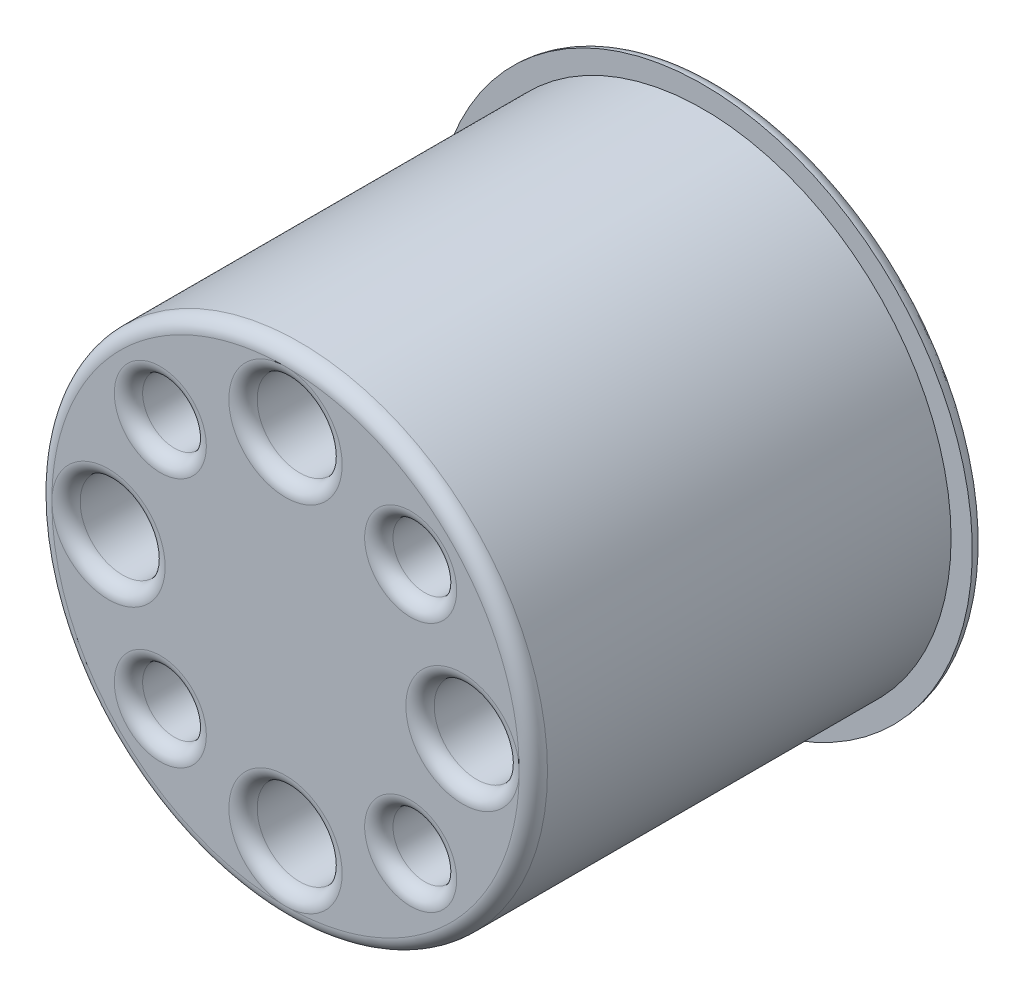
ISO-10303-21;
HEADER;
FILE_DESCRIPTION(('STEP AP214'),'2;1');
FILE_NAME('part.step','',(''),(''),'','','');
FILE_SCHEMA(('AUTOMOTIVE_DESIGN { 1 0 10303 214 1 1 1 1 }'));
ENDSEC;
DATA;
#1=APPLICATION_CONTEXT('core data for automotive mechanical design processes');
#2=APPLICATION_PROTOCOL_DEFINITION('international standard','automotive_design',2000,#1);
#3=PRODUCT_CONTEXT('',#1,'mechanical');
#4=PRODUCT('Part','Part','',(#3));
#5=PRODUCT_RELATED_PRODUCT_CATEGORY('part','',(#4));
#6=PRODUCT_DEFINITION_FORMATION('','',#4);
#7=PRODUCT_DEFINITION_CONTEXT('part definition',#1,'design');
#8=PRODUCT_DEFINITION('design','',#6,#7);
#9=PRODUCT_DEFINITION_SHAPE('','',#8);
#10=(LENGTH_UNIT() NAMED_UNIT(*) SI_UNIT(.MILLI.,.METRE.));
#11=(NAMED_UNIT(*) PLANE_ANGLE_UNIT() SI_UNIT($,.RADIAN.));
#12=(NAMED_UNIT(*) SI_UNIT($,.STERADIAN.) SOLID_ANGLE_UNIT());
#13=UNCERTAINTY_MEASURE_WITH_UNIT(LENGTH_MEASURE(1.E-05),#10,'distance_accuracy_value','');
#14=(GEOMETRIC_REPRESENTATION_CONTEXT(3) GLOBAL_UNCERTAINTY_ASSIGNED_CONTEXT((#13)) GLOBAL_UNIT_ASSIGNED_CONTEXT((#10,
#11,#12)) REPRESENTATION_CONTEXT('',''));
#15=CARTESIAN_POINT('',(0.,0.,0.));
#16=DIRECTION('',(0.,0.,1.));
#17=DIRECTION('',(1.,0.,0.));
#18=AXIS2_PLACEMENT_3D('',#15,#16,#17);
#19=CARTESIAN_POINT('',(12.5,-1.30930550206618E-13,29.5));
#20=DIRECTION('',(0.,0.,-1.));
#21=DIRECTION('',(-1.,0.,0.));
#22=AXIS2_PLACEMENT_3D('',#19,#20,#21);
#23=CYLINDRICAL_SURFACE('',#22,1.65);
#24=CARTESIAN_POINT('',(12.5,-1.30930550206618E-13,0.));
#25=DIRECTION('',(0.,0.,-1.));
#26=DIRECTION('',(-1.,0.,0.));
#27=AXIS2_PLACEMENT_3D('',#24,#25,#26);
#28=CIRCLE('',#27,1.65);
#29=CARTESIAN_POINT('',(10.85,-1.30930550206618E-13,0.));
#30=VERTEX_POINT('',#29);
#31=EDGE_CURVE('E266',#30,#30,#28,.T.);
#32=ORIENTED_EDGE('',*,*,#31,.T.);
#33=EDGE_LOOP('',(#32));
#34=FACE_BOUND('',#33,.T.);
#35=CARTESIAN_POINT('',(12.5,-1.30930550206618E-13,8.));
#36=DIRECTION('',(0.,0.,-1.));
#37=DIRECTION('',(-1.,0.,0.));
#38=AXIS2_PLACEMENT_3D('',#35,#36,#37);
#39=CIRCLE('',#38,1.65);
#40=CARTESIAN_POINT('',(10.85,-1.30930550206618E-13,8.));
#41=VERTEX_POINT('',#40);
#42=EDGE_CURVE('E263',#41,#41,#39,.T.);
#43=ORIENTED_EDGE('',*,*,#42,.F.);
#44=EDGE_LOOP('',(#43));
#45=FACE_BOUND('',#44,.T.);
#46=ADVANCED_FACE('F43',(#34,#45),#23,.F.);
#47=CARTESIAN_POINT('',(0.,-12.5,29.5));
#48=DIRECTION('',(0.,0.,-1.));
#49=DIRECTION('',(-1.,0.,0.));
#50=AXIS2_PLACEMENT_3D('',#47,#48,#49);
#51=CYLINDRICAL_SURFACE('',#50,1.65);
#52=CARTESIAN_POINT('',(0.,-12.5,0.));
#53=DIRECTION('',(0.,0.,-1.));
#54=DIRECTION('',(-1.,0.,0.));
#55=AXIS2_PLACEMENT_3D('',#52,#53,#54);
#56=CIRCLE('',#55,1.65);
#57=CARTESIAN_POINT('',(-1.65,-12.5,0.));
#58=VERTEX_POINT('',#57);
#59=EDGE_CURVE('E299',#58,#58,#56,.T.);
#60=ORIENTED_EDGE('',*,*,#59,.T.);
#61=EDGE_LOOP('',(#60));
#62=FACE_BOUND('',#61,.T.);
#63=CARTESIAN_POINT('',(0.,-12.5,8.));
#64=DIRECTION('',(0.,0.,-1.));
#65=DIRECTION('',(-1.,0.,0.));
#66=AXIS2_PLACEMENT_3D('',#63,#64,#65);
#67=CIRCLE('',#66,1.65);
#68=CARTESIAN_POINT('',(-1.65,-12.5,8.));
#69=VERTEX_POINT('',#68);
#70=EDGE_CURVE('E272',#69,#69,#67,.T.);
#71=ORIENTED_EDGE('',*,*,#70,.F.);
#72=EDGE_LOOP('',(#71));
#73=FACE_BOUND('',#72,.T.);
#74=ADVANCED_FACE('F158',(#62,#73),#51,.F.);
#75=CARTESIAN_POINT('',(-12.5,0.,29.5));
#76=DIRECTION('',(0.,0.,-1.));
#77=DIRECTION('',(-1.,0.,0.));
#78=AXIS2_PLACEMENT_3D('',#75,#76,#77);
#79=CYLINDRICAL_SURFACE('',#78,1.65);
#80=CARTESIAN_POINT('',(-12.5,0.,0.));
#81=DIRECTION('',(0.,0.,-1.));
#82=DIRECTION('',(-1.,0.,0.));
#83=AXIS2_PLACEMENT_3D('',#80,#81,#82);
#84=CIRCLE('',#83,1.65);
#85=CARTESIAN_POINT('',(-14.15,0.,0.));
#86=VERTEX_POINT('',#85);
#87=EDGE_CURVE('E293',#86,#86,#84,.T.);
#88=ORIENTED_EDGE('',*,*,#87,.T.);
#89=EDGE_LOOP('',(#88));
#90=FACE_BOUND('',#89,.T.);
#91=CARTESIAN_POINT('',(-12.5,0.,8.));
#92=DIRECTION('',(0.,0.,-1.));
#93=DIRECTION('',(-1.,0.,0.));
#94=AXIS2_PLACEMENT_3D('',#91,#92,#93);
#95=CIRCLE('',#94,1.65);
#96=CARTESIAN_POINT('',(-14.15,0.,8.));
#97=VERTEX_POINT('',#96);
#98=EDGE_CURVE('E269',#97,#97,#95,.T.);
#99=ORIENTED_EDGE('',*,*,#98,.F.);
#100=EDGE_LOOP('',(#99));
#101=FACE_BOUND('',#100,.T.);
#102=ADVANCED_FACE('F165',(#90,#101),#79,.F.);
#103=CARTESIAN_POINT('',(0.,12.5,29.5));
#104=DIRECTION('',(0.,0.,-1.));
#105=DIRECTION('',(-1.,0.,0.));
#106=AXIS2_PLACEMENT_3D('',#103,#104,#105);
#107=CYLINDRICAL_SURFACE('',#106,1.65);
#108=CARTESIAN_POINT('',(0.,12.5,0.));
#109=DIRECTION('',(0.,0.,-1.));
#110=DIRECTION('',(-1.,0.,0.));
#111=AXIS2_PLACEMENT_3D('',#108,#109,#110);
#112=CIRCLE('',#111,1.65);
#113=CARTESIAN_POINT('',(-1.64999999999991,12.5,0.));
#114=VERTEX_POINT('',#113);
#115=EDGE_CURVE('E296',#114,#114,#112,.T.);
#116=ORIENTED_EDGE('',*,*,#115,.T.);
#117=EDGE_LOOP('',(#116));
#118=FACE_BOUND('',#117,.T.);
#119=CARTESIAN_POINT('',(0.,12.5,8.));
#120=DIRECTION('',(0.,0.,-1.));
#121=DIRECTION('',(-1.,0.,0.));
#122=AXIS2_PLACEMENT_3D('',#119,#120,#121);
#123=CIRCLE('',#122,1.65);
#124=CARTESIAN_POINT('',(-1.64999999999991,12.5,8.));
#125=VERTEX_POINT('',#124);
#126=EDGE_CURVE('E253',#125,#125,#123,.T.);
#127=ORIENTED_EDGE('',*,*,#126,.F.);
#128=EDGE_LOOP('',(#127));
#129=FACE_BOUND('',#128,.T.);
#130=ADVANCED_FACE('F176',(#118,#129),#107,.F.);
#131=CARTESIAN_POINT('',(0.,0.,29.5));
#132=DIRECTION('',(0.,0.,-1.));
#133=DIRECTION('',(-1.,0.,0.));
#134=AXIS2_PLACEMENT_3D('',#131,#132,#133);
#135=CYLINDRICAL_SURFACE('',#134,17.5);
#136=CARTESIAN_POINT('',(0.,0.,28.5));
#137=DIRECTION('',(0.,0.,1.));
#138=DIRECTION('',(1.,0.,0.));
#139=AXIS2_PLACEMENT_3D('',#136,#137,#138);
#140=CIRCLE('',#139,17.5);
#141=CARTESIAN_POINT('',(17.5,0.,28.5));
#142=VERTEX_POINT('',#141);
#143=EDGE_CURVE('E118',#142,#142,#140,.F.);
#144=ORIENTED_EDGE('',*,*,#143,.T.);
#145=EDGE_LOOP('',(#144));
#146=FACE_BOUND('',#145,.T.);
#147=CARTESIAN_POINT('',(0.,0.,0.));
#148=DIRECTION('',(0.,0.,1.));
#149=DIRECTION('',(1.,0.,0.));
#150=AXIS2_PLACEMENT_3D('',#147,#148,#149);
#151=CIRCLE('',#150,17.5);
#152=CARTESIAN_POINT('',(17.5,0.,0.));
#153=VERTEX_POINT('',#152);
#154=EDGE_CURVE('E262',#153,#153,#151,.T.);
#155=ORIENTED_EDGE('',*,*,#154,.T.);
#156=EDGE_LOOP('',(#155));
#157=FACE_BOUND('',#156,.T.);
#158=ADVANCED_FACE('F171',(#146,#157),#135,.T.);
#159=CARTESIAN_POINT('',(0.,0.,29.5));
#160=DIRECTION('',(0.,0.,1.));
#161=DIRECTION('',(1.,0.,0.));
#162=AXIS2_PLACEMENT_3D('',#159,#160,#161);
#163=PLANE('',#162);
#164=CARTESIAN_POINT('',(0.,0.,29.5));
#165=DIRECTION('',(0.,0.,1.));
#166=DIRECTION('',(1.,0.,0.));
#167=AXIS2_PLACEMENT_3D('',#164,#165,#166);
#168=CIRCLE('',#167,16.5);
#169=CARTESIAN_POINT('',(-2.30437768363647E-13,-16.5,29.5));
#170=VERTEX_POINT('',#169);
#171=CARTESIAN_POINT('',(16.5,0.,29.5));
#172=VERTEX_POINT('',#171);
#173=EDGE_CURVE('E103',#170,#172,#168,.T.);
#174=ORIENTED_EDGE('',*,*,#173,.T.);
#175=CARTESIAN_POINT('',(12.5,-1.30930550206618E-13,29.5));
#176=DIRECTION('',(0.,0.,1.));
#177=DIRECTION('',(1.,0.,0.));
#178=AXIS2_PLACEMENT_3D('',#175,#176,#177);
#179=CIRCLE('',#178,4.);
#180=EDGE_CURVE('E56',#172,#172,#179,.F.);
#181=ORIENTED_EDGE('',*,*,#180,.T.);
#182=CARTESIAN_POINT('',(0.,0.,29.5));
#183=DIRECTION('',(0.,0.,1.));
#184=DIRECTION('',(1.,0.,0.));
#185=AXIS2_PLACEMENT_3D('',#182,#183,#184);
#186=CIRCLE('',#185,16.5);
#187=CARTESIAN_POINT('',(1.15218884181823E-13,16.5,29.5));
#188=VERTEX_POINT('',#187);
#189=EDGE_CURVE('E96',#172,#188,#186,.T.);
#190=ORIENTED_EDGE('',*,*,#189,.T.);
#191=CARTESIAN_POINT('',(0.,12.5,29.5));
#192=DIRECTION('',(0.,0.,1.));
#193=DIRECTION('',(1.,0.,0.));
#194=AXIS2_PLACEMENT_3D('',#191,#192,#193);
#195=CIRCLE('',#194,4.);
#196=CARTESIAN_POINT('',(4.00000000000009,12.5,29.5));
#197=VERTEX_POINT('',#196);
#198=EDGE_CURVE('E80',#188,#197,#195,.F.);
#199=ORIENTED_EDGE('',*,*,#198,.T.);
#200=CARTESIAN_POINT('',(0.,12.5,29.5));
#201=DIRECTION('',(0.,0.,1.));
#202=DIRECTION('',(1.,0.,0.));
#203=AXIS2_PLACEMENT_3D('',#200,#201,#202);
#204=CIRCLE('',#203,4.);
#205=EDGE_CURVE('E85',#197,#188,#204,.F.);
#206=ORIENTED_EDGE('',*,*,#205,.T.);
#207=CARTESIAN_POINT('',(0.,0.,29.5));
#208=DIRECTION('',(0.,0.,1.));
#209=DIRECTION('',(1.,0.,0.));
#210=AXIS2_PLACEMENT_3D('',#207,#208,#209);
#211=CIRCLE('',#210,16.5);
#212=CARTESIAN_POINT('',(-16.5,2.90337045442848E-13,29.5));
#213=VERTEX_POINT('',#212);
#214=EDGE_CURVE('E93',#188,#213,#211,.T.);
#215=ORIENTED_EDGE('',*,*,#214,.T.);
#216=CARTESIAN_POINT('',(-12.5,2.19952307153673E-13,29.5));
#217=DIRECTION('',(0.,0.,1.));
#218=DIRECTION('',(1.,0.,0.));
#219=AXIS2_PLACEMENT_3D('',#216,#217,#218);
#220=CIRCLE('',#219,4.);
#221=CARTESIAN_POINT('',(-8.5,2.19952307153673E-13,29.5));
#222=VERTEX_POINT('',#221);
#223=EDGE_CURVE('E98',#213,#222,#220,.F.);
#224=ORIENTED_EDGE('',*,*,#223,.T.);
#225=CARTESIAN_POINT('',(-12.5,2.19952307153673E-13,29.5));
#226=DIRECTION('',(0.,0.,1.));
#227=DIRECTION('',(1.,0.,0.));
#228=AXIS2_PLACEMENT_3D('',#225,#226,#227);
#229=CIRCLE('',#228,4.);
#230=EDGE_CURVE('E109',#222,#213,#229,.F.);
#231=ORIENTED_EDGE('',*,*,#230,.T.);
#232=CARTESIAN_POINT('',(0.,0.,29.5));
#233=DIRECTION('',(0.,0.,1.));
#234=DIRECTION('',(1.,0.,0.));
#235=AXIS2_PLACEMENT_3D('',#232,#233,#234);
#236=CIRCLE('',#235,16.5);
#237=EDGE_CURVE('E97',#213,#170,#236,.T.);
#238=ORIENTED_EDGE('',*,*,#237,.T.);
#239=CARTESIAN_POINT('',(-1.74574066942157E-13,-12.5,29.5));
#240=DIRECTION('',(0.,0.,1.));
#241=DIRECTION('',(1.,0.,0.));
#242=AXIS2_PLACEMENT_3D('',#239,#240,#241);
#243=CIRCLE('',#242,4.);
#244=CARTESIAN_POINT('',(3.99999999999983,-12.5,29.5));
#245=VERTEX_POINT('',#244);
#246=EDGE_CURVE('E63',#170,#245,#243,.F.);
#247=ORIENTED_EDGE('',*,*,#246,.T.);
#248=CARTESIAN_POINT('',(-1.74574066942157E-13,-12.5,29.5));
#249=DIRECTION('',(0.,0.,1.));
#250=DIRECTION('',(1.,0.,0.));
#251=AXIS2_PLACEMENT_3D('',#248,#249,#250);
#252=CIRCLE('',#251,4.);
#253=EDGE_CURVE('E114',#245,#170,#252,.F.);
#254=ORIENTED_EDGE('',*,*,#253,.T.);
#255=EDGE_LOOP('',(#174,#181,#190,#199,#206,#215,#224,#231,#238,#247,#254));
#256=FACE_BOUND('',#255,.T.);
#257=CARTESIAN_POINT('',(-8.83883476483177,8.83883476483192,29.5));
#258=DIRECTION('',(0.,0.,1.));
#259=DIRECTION('',(1.,0.,0.));
#260=AXIS2_PLACEMENT_3D('',#257,#258,#259);
#261=CIRCLE('',#260,3.25);
#262=CARTESIAN_POINT('',(-5.58883476483177,8.83883476483192,29.5));
#263=VERTEX_POINT('',#262);
#264=EDGE_CURVE('E87',#263,#263,#261,.F.);
#265=ORIENTED_EDGE('',*,*,#264,.T.);
#266=EDGE_LOOP('',(#265));
#267=FACE_BOUND('',#266,.T.);
#268=CARTESIAN_POINT('',(8.83883476483183,8.83883476483186,29.5));
#269=DIRECTION('',(0.,0.,1.));
#270=DIRECTION('',(1.,0.,0.));
#271=AXIS2_PLACEMENT_3D('',#268,#269,#270);
#272=CIRCLE('',#271,3.25);
#273=CARTESIAN_POINT('',(12.0888347648318,8.83883476483186,29.5));
#274=VERTEX_POINT('',#273);
#275=EDGE_CURVE('E308',#274,#274,#272,.F.);
#276=ORIENTED_EDGE('',*,*,#275,.T.);
#277=EDGE_LOOP('',(#276));
#278=FACE_BOUND('',#277,.T.);
#279=CARTESIAN_POINT('',(8.83883476483183,-8.83883476483186,29.5));
#280=DIRECTION('',(0.,0.,1.));
#281=DIRECTION('',(1.,0.,0.));
#282=AXIS2_PLACEMENT_3D('',#279,#280,#281);
#283=CIRCLE('',#282,3.25);
#284=CARTESIAN_POINT('',(12.0888347648318,-8.83883476483186,29.5));
#285=VERTEX_POINT('',#284);
#286=EDGE_CURVE('E305',#285,#285,#283,.F.);
#287=ORIENTED_EDGE('',*,*,#286,.T.);
#288=EDGE_LOOP('',(#287));
#289=FACE_BOUND('',#288,.T.);
#290=CARTESIAN_POINT('',(-8.83883476483189,-8.8388347648318,29.5));
#291=DIRECTION('',(0.,0.,1.));
#292=DIRECTION('',(1.,0.,0.));
#293=AXIS2_PLACEMENT_3D('',#290,#291,#292);
#294=CIRCLE('',#293,3.25);
#295=CARTESIAN_POINT('',(-5.58883476483189,-8.8388347648318,29.5));
#296=VERTEX_POINT('',#295);
#297=EDGE_CURVE('E302',#296,#296,#294,.F.);
#298=ORIENTED_EDGE('',*,*,#297,.T.);
#299=EDGE_LOOP('',(#298));
#300=FACE_BOUND('',#299,.T.);
#301=ADVANCED_FACE('F101',(#256,#267,#278,#289,#300),#163,.T.);
#302=CARTESIAN_POINT('',(0.,0.,-1.));
#303=DIRECTION('',(0.,0.,-1.));
#304=DIRECTION('',(-1.,0.,0.));
#305=AXIS2_PLACEMENT_3D('',#302,#303,#304);
#306=PLANE('',#305);
#307=CARTESIAN_POINT('',(12.5,-1.30930550206618E-13,-1.));
#308=DIRECTION('',(0.,0.,-1.));
#309=DIRECTION('',(-1.,0.,0.));
#310=AXIS2_PLACEMENT_3D('',#307,#308,#309);
#311=CIRCLE('',#310,2.65);
#312=CARTESIAN_POINT('',(9.85,-1.30930550206618E-13,-1.));
#313=VERTEX_POINT('',#312);
#314=EDGE_CURVE('E290',#313,#313,#311,.F.);
#315=ORIENTED_EDGE('',*,*,#314,.T.);
#316=EDGE_LOOP('',(#315));
#317=FACE_BOUND('',#316,.T.);
#318=CARTESIAN_POINT('',(-12.5,0.,-1.));
#319=DIRECTION('',(0.,0.,-1.));
#320=DIRECTION('',(-1.,0.,0.));
#321=AXIS2_PLACEMENT_3D('',#318,#319,#320);
#322=CIRCLE('',#321,2.65);
#323=CARTESIAN_POINT('',(-15.15,0.,-1.));
#324=VERTEX_POINT('',#323);
#325=EDGE_CURVE('E287',#324,#324,#322,.F.);
#326=ORIENTED_EDGE('',*,*,#325,.T.);
#327=EDGE_LOOP('',(#326));
#328=FACE_BOUND('',#327,.T.);
#329=CARTESIAN_POINT('',(0.,0.,-1.));
#330=DIRECTION('',(0.,0.,-1.));
#331=DIRECTION('',(-1.,0.,0.));
#332=AXIS2_PLACEMENT_3D('',#329,#330,#331);
#333=CIRCLE('',#332,18.);
#334=CARTESIAN_POINT('',(-18.,0.,-1.));
#335=VERTEX_POINT('',#334);
#336=EDGE_CURVE('E284',#335,#335,#333,.T.);
#337=ORIENTED_EDGE('',*,*,#336,.T.);
#338=EDGE_LOOP('',(#337));
#339=FACE_BOUND('',#338,.T.);
#340=CARTESIAN_POINT('',(0.,12.5,-1.));
#341=DIRECTION('',(0.,0.,-1.));
#342=DIRECTION('',(-1.,0.,0.));
#343=AXIS2_PLACEMENT_3D('',#340,#341,#342);
#344=CIRCLE('',#343,2.65);
#345=CARTESIAN_POINT('',(-2.64999999999991,12.5,-1.));
#346=VERTEX_POINT('',#345);
#347=EDGE_CURVE('E281',#346,#346,#344,.F.);
#348=ORIENTED_EDGE('',*,*,#347,.T.);
#349=EDGE_LOOP('',(#348));
#350=FACE_BOUND('',#349,.T.);
#351=CARTESIAN_POINT('',(0.,-12.5,-1.));
#352=DIRECTION('',(0.,0.,-1.));
#353=DIRECTION('',(-1.,0.,0.));
#354=AXIS2_PLACEMENT_3D('',#351,#352,#353);
#355=CIRCLE('',#354,2.65);
#356=CARTESIAN_POINT('',(-2.65,-12.5,-1.));
#357=VERTEX_POINT('',#356);
#358=EDGE_CURVE('E278',#357,#357,#355,.F.);
#359=ORIENTED_EDGE('',*,*,#358,.T.);
#360=EDGE_LOOP('',(#359));
#361=FACE_BOUND('',#360,.T.);
#362=ADVANCED_FACE('F312',(#317,#328,#339,#350,#361),#306,.T.);
#363=CARTESIAN_POINT('',(0.,0.,0.));
#364=DIRECTION('',(0.,0.,-1.));
#365=DIRECTION('',(-1.,0.,0.));
#366=AXIS2_PLACEMENT_3D('',#363,#364,#365);
#367=PLANE('',#366);
#368=ORIENTED_EDGE('',*,*,#154,.F.);
#369=EDGE_LOOP('',(#368));
#370=FACE_BOUND('',#369,.T.);
#371=CARTESIAN_POINT('',(0.,0.,0.));
#372=DIRECTION('',(0.,0.,-1.));
#373=DIRECTION('',(-1.,0.,0.));
#374=AXIS2_PLACEMENT_3D('',#371,#372,#373);
#375=CIRCLE('',#374,19.);
#376=CARTESIAN_POINT('',(-19.,0.,0.));
#377=VERTEX_POINT('',#376);
#378=EDGE_CURVE('E259',#377,#377,#375,.T.);
#379=ORIENTED_EDGE('',*,*,#378,.F.);
#380=EDGE_LOOP('',(#379));
#381=FACE_BOUND('',#380,.T.);
#382=ADVANCED_FACE('F375',(#370,#381),#367,.F.);
#383=CARTESIAN_POINT('',(0.,0.,8.));
#384=DIRECTION('',(0.,0.,-1.));
#385=DIRECTION('',(-1.,0.,0.));
#386=AXIS2_PLACEMENT_3D('',#383,#384,#385);
#387=PLANE('',#386);
#388=ORIENTED_EDGE('',*,*,#98,.T.);
#389=EDGE_LOOP('',(#388));
#390=FACE_BOUND('',#389,.T.);
#391=CARTESIAN_POINT('',(-12.5,2.19952307153673E-13,8.));
#392=DIRECTION('',(0.,0.,-1.));
#393=DIRECTION('',(-1.,0.,0.));
#394=AXIS2_PLACEMENT_3D('',#391,#392,#393);
#395=CIRCLE('',#394,3.);
#396=CARTESIAN_POINT('',(-15.5,2.19952307153673E-13,8.));
#397=VERTEX_POINT('',#396);
#398=EDGE_CURVE('E237',#397,#397,#395,.F.);
#399=ORIENTED_EDGE('',*,*,#398,.T.);
#400=EDGE_LOOP('',(#399));
#401=FACE_BOUND('',#400,.T.);
#402=ADVANCED_FACE('F372',(#390,#401),#387,.F.);
#403=CARTESIAN_POINT('',(-12.5,2.19952307153673E-13,-9.48528137423858));
#404=DIRECTION('',(0.,0.,1.));
#405=DIRECTION('',(1.,0.,0.));
#406=AXIS2_PLACEMENT_3D('',#403,#404,#405);
#407=CYLINDRICAL_SURFACE('',#406,3.);
#408=CARTESIAN_POINT('',(-12.5,2.19952307153673E-13,28.5));
#409=DIRECTION('',(0.,0.,1.));
#410=DIRECTION('',(1.,0.,0.));
#411=AXIS2_PLACEMENT_3D('',#408,#409,#410);
#412=CIRCLE('',#411,3.);
#413=CARTESIAN_POINT('',(-9.5,2.19952307153673E-13,28.5));
#414=VERTEX_POINT('',#413);
#415=EDGE_CURVE('E121',#414,#414,#412,.T.);
#416=ORIENTED_EDGE('',*,*,#415,.T.);
#417=EDGE_LOOP('',(#416));
#418=FACE_BOUND('',#417,.T.);
#419=ORIENTED_EDGE('',*,*,#398,.F.);
#420=EDGE_LOOP('',(#419));
#421=FACE_BOUND('',#420,.T.);
#422=ADVANCED_FACE('F367',(#418,#421),#407,.F.);
#423=CARTESIAN_POINT('',(0.,0.,8.));
#424=DIRECTION('',(0.,0.,-1.));
#425=DIRECTION('',(-1.,0.,0.));
#426=AXIS2_PLACEMENT_3D('',#423,#424,#425);
#427=PLANE('',#426);
#428=ORIENTED_EDGE('',*,*,#70,.T.);
#429=EDGE_LOOP('',(#428));
#430=FACE_BOUND('',#429,.T.);
#431=CARTESIAN_POINT('',(-1.74574066942157E-13,-12.5,8.));
#432=DIRECTION('',(0.,0.,-1.));
#433=DIRECTION('',(-1.,0.,0.));
#434=AXIS2_PLACEMENT_3D('',#431,#432,#433);
#435=CIRCLE('',#434,3.);
#436=CARTESIAN_POINT('',(-3.00000000000017,-12.5,8.));
#437=VERTEX_POINT('',#436);
#438=EDGE_CURVE('E241',#437,#437,#435,.F.);
#439=ORIENTED_EDGE('',*,*,#438,.T.);
#440=EDGE_LOOP('',(#439));
#441=FACE_BOUND('',#440,.T.);
#442=ADVANCED_FACE('F364',(#430,#441),#427,.F.);
#443=CARTESIAN_POINT('',(-1.74574066942157E-13,-12.5,-9.48528137423858));
#444=DIRECTION('',(0.,0.,1.));
#445=DIRECTION('',(1.,0.,0.));
#446=AXIS2_PLACEMENT_3D('',#443,#444,#445);
#447=CYLINDRICAL_SURFACE('',#446,3.);
#448=CARTESIAN_POINT('',(-1.74574066942157E-13,-12.5,28.5));
#449=DIRECTION('',(0.,0.,1.));
#450=DIRECTION('',(1.,0.,0.));
#451=AXIS2_PLACEMENT_3D('',#448,#449,#450);
#452=CIRCLE('',#451,3.);
#453=CARTESIAN_POINT('',(2.99999999999983,-12.5,28.5));
#454=VERTEX_POINT('',#453);
#455=EDGE_CURVE('E124',#454,#454,#452,.T.);
#456=ORIENTED_EDGE('',*,*,#455,.T.);
#457=EDGE_LOOP('',(#456));
#458=FACE_BOUND('',#457,.T.);
#459=ORIENTED_EDGE('',*,*,#438,.F.);
#460=EDGE_LOOP('',(#459));
#461=FACE_BOUND('',#460,.T.);
#462=ADVANCED_FACE('F359',(#458,#461),#447,.F.);
#463=CARTESIAN_POINT('',(0.,0.,8.));
#464=DIRECTION('',(0.,0.,-1.));
#465=DIRECTION('',(-1.,0.,0.));
#466=AXIS2_PLACEMENT_3D('',#463,#464,#465);
#467=PLANE('',#466);
#468=ORIENTED_EDGE('',*,*,#42,.T.);
#469=EDGE_LOOP('',(#468));
#470=FACE_BOUND('',#469,.T.);
#471=CARTESIAN_POINT('',(12.5,-1.30930550206618E-13,8.));
#472=DIRECTION('',(0.,0.,-1.));
#473=DIRECTION('',(-1.,0.,0.));
#474=AXIS2_PLACEMENT_3D('',#471,#472,#473);
#475=CIRCLE('',#474,3.);
#476=CARTESIAN_POINT('',(9.5,-1.30930550206618E-13,8.));
#477=VERTEX_POINT('',#476);
#478=EDGE_CURVE('E254',#477,#477,#475,.F.);
#479=ORIENTED_EDGE('',*,*,#478,.T.);
#480=EDGE_LOOP('',(#479));
#481=FACE_BOUND('',#480,.T.);
#482=ADVANCED_FACE('F356',(#470,#481),#467,.F.);
#483=CARTESIAN_POINT('',(12.5,-1.30930550206618E-13,-9.48528137423858));
#484=DIRECTION('',(0.,0.,1.));
#485=DIRECTION('',(1.,0.,0.));
#486=AXIS2_PLACEMENT_3D('',#483,#484,#485);
#487=CYLINDRICAL_SURFACE('',#486,3.);
#488=CARTESIAN_POINT('',(12.5,-1.30930550206618E-13,28.5));
#489=DIRECTION('',(0.,0.,1.));
#490=DIRECTION('',(1.,0.,0.));
#491=AXIS2_PLACEMENT_3D('',#488,#489,#490);
#492=CIRCLE('',#491,3.);
#493=CARTESIAN_POINT('',(15.5,-1.30930550206618E-13,28.5));
#494=VERTEX_POINT('',#493);
#495=EDGE_CURVE('E127',#494,#494,#492,.T.);
#496=ORIENTED_EDGE('',*,*,#495,.T.);
#497=EDGE_LOOP('',(#496));
#498=FACE_BOUND('',#497,.T.);
#499=ORIENTED_EDGE('',*,*,#478,.F.);
#500=EDGE_LOOP('',(#499));
#501=FACE_BOUND('',#500,.T.);
#502=ADVANCED_FACE('F354',(#498,#501),#487,.F.);
#503=CARTESIAN_POINT('',(0.,0.,8.));
#504=DIRECTION('',(0.,0.,-1.));
#505=DIRECTION('',(-1.,0.,0.));
#506=AXIS2_PLACEMENT_3D('',#503,#504,#505);
#507=PLANE('',#506);
#508=ORIENTED_EDGE('',*,*,#126,.T.);
#509=EDGE_LOOP('',(#508));
#510=FACE_BOUND('',#509,.T.);
#511=CARTESIAN_POINT('',(0.,12.5,8.));
#512=DIRECTION('',(0.,0.,-1.));
#513=DIRECTION('',(-1.,0.,0.));
#514=AXIS2_PLACEMENT_3D('',#511,#512,#513);
#515=CIRCLE('',#514,3.);
#516=CARTESIAN_POINT('',(-2.99999999999991,12.5,8.));
#517=VERTEX_POINT('',#516);
#518=EDGE_CURVE('E250',#517,#517,#515,.F.);
#519=ORIENTED_EDGE('',*,*,#518,.T.);
#520=EDGE_LOOP('',(#519));
#521=FACE_BOUND('',#520,.T.);
#522=ADVANCED_FACE('F350',(#510,#521),#507,.F.);
#523=CARTESIAN_POINT('',(0.,12.5,-9.48528137423858));
#524=DIRECTION('',(0.,0.,1.));
#525=DIRECTION('',(1.,0.,0.));
#526=AXIS2_PLACEMENT_3D('',#523,#524,#525);
#527=CYLINDRICAL_SURFACE('',#526,3.);
#528=CARTESIAN_POINT('',(0.,12.5,28.5));
#529=DIRECTION('',(0.,0.,1.));
#530=DIRECTION('',(1.,0.,0.));
#531=AXIS2_PLACEMENT_3D('',#528,#529,#530);
#532=CIRCLE('',#531,3.);
#533=CARTESIAN_POINT('',(3.00000000000009,12.5,28.5));
#534=VERTEX_POINT('',#533);
#535=EDGE_CURVE('E130',#534,#534,#532,.T.);
#536=ORIENTED_EDGE('',*,*,#535,.T.);
#537=EDGE_LOOP('',(#536));
#538=FACE_BOUND('',#537,.T.);
#539=ORIENTED_EDGE('',*,*,#518,.F.);
#540=EDGE_LOOP('',(#539));
#541=FACE_BOUND('',#540,.T.);
#542=ADVANCED_FACE('F231',(#538,#541),#527,.F.);
#543=CARTESIAN_POINT('',(-8.83883476483177,8.83883476483192,19.5));
#544=DIRECTION('',(0.,0.,1.));
#545=DIRECTION('',(1.,0.,0.));
#546=AXIS2_PLACEMENT_3D('',#543,#544,#545);
#547=CYLINDRICAL_SURFACE('',#546,2.25);
#548=CARTESIAN_POINT('',(-8.83883476483177,8.83883476483192,28.5));
#549=DIRECTION('',(0.,0.,1.));
#550=DIRECTION('',(1.,0.,0.));
#551=AXIS2_PLACEMENT_3D('',#548,#549,#550);
#552=CIRCLE('',#551,2.25);
#553=CARTESIAN_POINT('',(-6.58883476483177,8.83883476483192,28.5));
#554=VERTEX_POINT('',#553);
#555=EDGE_CURVE('E133',#554,#554,#552,.T.);
#556=ORIENTED_EDGE('',*,*,#555,.T.);
#557=EDGE_LOOP('',(#556));
#558=FACE_BOUND('',#557,.T.);
#559=CARTESIAN_POINT('',(-8.83883476483177,8.83883476483192,19.5));
#560=DIRECTION('',(0.,0.,1.));
#561=DIRECTION('',(1.,0.,0.));
#562=AXIS2_PLACEMENT_3D('',#559,#560,#561);
#563=CIRCLE('',#562,2.25);
#564=CARTESIAN_POINT('',(-6.58883476483177,8.83883476483192,19.5));
#565=VERTEX_POINT('',#564);
#566=EDGE_CURVE('E235',#565,#565,#563,.T.);
#567=ORIENTED_EDGE('',*,*,#566,.F.);
#568=EDGE_LOOP('',(#567));
#569=FACE_BOUND('',#568,.T.);
#570=ADVANCED_FACE('F227',(#558,#569),#547,.F.);
#571=CARTESIAN_POINT('',(0.,0.,19.5));
#572=DIRECTION('',(0.,0.,1.));
#573=DIRECTION('',(1.,0.,0.));
#574=AXIS2_PLACEMENT_3D('',#571,#572,#573);
#575=PLANE('',#574);
#576=ORIENTED_EDGE('',*,*,#566,.T.);
#577=EDGE_LOOP('',(#576));
#578=FACE_BOUND('',#577,.T.);
#579=ADVANCED_FACE('F230',(#578),#575,.T.);
#580=CARTESIAN_POINT('',(8.83883476483183,8.83883476483186,19.5));
#581=DIRECTION('',(0.,0.,1.));
#582=DIRECTION('',(1.,0.,0.));
#583=AXIS2_PLACEMENT_3D('',#580,#581,#582);
#584=CYLINDRICAL_SURFACE('',#583,2.25);
#585=CARTESIAN_POINT('',(8.83883476483183,8.83883476483186,28.5));
#586=DIRECTION('',(0.,0.,1.));
#587=DIRECTION('',(1.,0.,0.));
#588=AXIS2_PLACEMENT_3D('',#585,#586,#587);
#589=CIRCLE('',#588,2.25);
#590=CARTESIAN_POINT('',(11.0888347648318,8.83883476483186,28.5));
#591=VERTEX_POINT('',#590);
#592=EDGE_CURVE('E136',#591,#591,#589,.T.);
#593=ORIENTED_EDGE('',*,*,#592,.T.);
#594=EDGE_LOOP('',(#593));
#595=FACE_BOUND('',#594,.T.);
#596=CARTESIAN_POINT('',(8.83883476483183,8.83883476483186,19.5));
#597=DIRECTION('',(0.,0.,1.));
#598=DIRECTION('',(1.,0.,0.));
#599=AXIS2_PLACEMENT_3D('',#596,#597,#598);
#600=CIRCLE('',#599,2.25);
#601=CARTESIAN_POINT('',(11.0888347648318,8.83883476483186,19.5));
#602=VERTEX_POINT('',#601);
#603=EDGE_CURVE('E238',#602,#602,#600,.T.);
#604=ORIENTED_EDGE('',*,*,#603,.F.);
#605=EDGE_LOOP('',(#604));
#606=FACE_BOUND('',#605,.T.);
#607=ADVANCED_FACE('F340',(#595,#606),#584,.F.);
#608=CARTESIAN_POINT('',(8.83883476483183,8.83883476483186,19.5));
#609=DIRECTION('',(0.,0.,1.));
#610=DIRECTION('',(1.,0.,0.));
#611=AXIS2_PLACEMENT_3D('',#608,#609,#610);
#612=PLANE('',#611);
#613=ORIENTED_EDGE('',*,*,#603,.T.);
#614=EDGE_LOOP('',(#613));
#615=FACE_BOUND('',#614,.T.);
#616=ADVANCED_FACE('F332',(#615),#612,.T.);
#617=CARTESIAN_POINT('',(8.83883476483183,-8.83883476483186,19.5));
#618=DIRECTION('',(0.,0.,1.));
#619=DIRECTION('',(1.,0.,0.));
#620=AXIS2_PLACEMENT_3D('',#617,#618,#619);
#621=CYLINDRICAL_SURFACE('',#620,2.25);
#622=CARTESIAN_POINT('',(8.83883476483183,-8.83883476483186,28.5));
#623=DIRECTION('',(0.,0.,1.));
#624=DIRECTION('',(1.,0.,0.));
#625=AXIS2_PLACEMENT_3D('',#622,#623,#624);
#626=CIRCLE('',#625,2.25);
#627=CARTESIAN_POINT('',(11.0888347648318,-8.83883476483186,28.5));
#628=VERTEX_POINT('',#627);
#629=EDGE_CURVE('E51',#628,#628,#626,.T.);
#630=ORIENTED_EDGE('',*,*,#629,.T.);
#631=EDGE_LOOP('',(#630));
#632=FACE_BOUND('',#631,.T.);
#633=CARTESIAN_POINT('',(8.83883476483183,-8.83883476483186,19.5));
#634=DIRECTION('',(0.,0.,1.));
#635=DIRECTION('',(1.,0.,0.));
#636=AXIS2_PLACEMENT_3D('',#633,#634,#635);
#637=CIRCLE('',#636,2.25);
#638=CARTESIAN_POINT('',(11.0888347648318,-8.83883476483186,19.5));
#639=VERTEX_POINT('',#638);
#640=EDGE_CURVE('E244',#639,#639,#637,.T.);
#641=ORIENTED_EDGE('',*,*,#640,.F.);
#642=EDGE_LOOP('',(#641));
#643=FACE_BOUND('',#642,.T.);
#644=ADVANCED_FACE('F141',(#632,#643),#621,.F.);
#645=CARTESIAN_POINT('',(8.83883476483183,-8.83883476483186,19.5));
#646=DIRECTION('',(0.,0.,1.));
#647=DIRECTION('',(1.,0.,0.));
#648=AXIS2_PLACEMENT_3D('',#645,#646,#647);
#649=PLANE('',#648);
#650=ORIENTED_EDGE('',*,*,#640,.T.);
#651=EDGE_LOOP('',(#650));
#652=FACE_BOUND('',#651,.T.);
#653=ADVANCED_FACE('F323',(#652),#649,.T.);
#654=CARTESIAN_POINT('',(-8.83883476483189,-8.8388347648318,19.5));
#655=DIRECTION('',(0.,0.,1.));
#656=DIRECTION('',(1.,0.,0.));
#657=AXIS2_PLACEMENT_3D('',#654,#655,#656);
#658=CYLINDRICAL_SURFACE('',#657,2.25);
#659=CARTESIAN_POINT('',(-8.83883476483189,-8.8388347648318,28.5));
#660=DIRECTION('',(0.,0.,1.));
#661=DIRECTION('',(1.,0.,0.));
#662=AXIS2_PLACEMENT_3D('',#659,#660,#661);
#663=CIRCLE('',#662,2.25);
#664=CARTESIAN_POINT('',(-6.58883476483189,-8.8388347648318,28.5));
#665=VERTEX_POINT('',#664);
#666=EDGE_CURVE('E12',#665,#665,#663,.T.);
#667=ORIENTED_EDGE('',*,*,#666,.T.);
#668=EDGE_LOOP('',(#667));
#669=FACE_BOUND('',#668,.T.);
#670=CARTESIAN_POINT('',(-8.83883476483189,-8.8388347648318,19.5));
#671=DIRECTION('',(0.,0.,1.));
#672=DIRECTION('',(1.,0.,0.));
#673=AXIS2_PLACEMENT_3D('',#670,#671,#672);
#674=CIRCLE('',#673,2.25);
#675=CARTESIAN_POINT('',(-6.58883476483189,-8.8388347648318,19.5));
#676=VERTEX_POINT('',#675);
#677=EDGE_CURVE('E248',#676,#676,#674,.T.);
#678=ORIENTED_EDGE('',*,*,#677,.F.);
#679=EDGE_LOOP('',(#678));
#680=FACE_BOUND('',#679,.T.);
#681=ADVANCED_FACE('F320',(#669,#680),#658,.F.);
#682=CARTESIAN_POINT('',(-8.83883476483189,-8.8388347648318,19.5));
#683=DIRECTION('',(0.,0.,1.));
#684=DIRECTION('',(1.,0.,0.));
#685=AXIS2_PLACEMENT_3D('',#682,#683,#684);
#686=PLANE('',#685);
#687=ORIENTED_EDGE('',*,*,#677,.T.);
#688=EDGE_LOOP('',(#687));
#689=FACE_BOUND('',#688,.T.);
#690=ADVANCED_FACE('F185',(#689),#686,.T.);
#691=CARTESIAN_POINT('',(12.5,-1.30930550206618E-13,0.));
#692=DIRECTION('',(0.,0.,-1.));
#693=DIRECTION('',(-1.,0.,0.));
#694=AXIS2_PLACEMENT_3D('',#691,#692,#693);
#695=TOROIDAL_SURFACE('',#694,2.65,1.);
#696=ORIENTED_EDGE('',*,*,#314,.F.);
#697=EDGE_LOOP('',(#696));
#698=FACE_BOUND('',#697,.T.);
#699=ORIENTED_EDGE('',*,*,#31,.F.);
#700=EDGE_LOOP('',(#699));
#701=FACE_BOUND('',#700,.T.);
#702=ADVANCED_FACE('F181',(#698,#701),#695,.T.);
#703=CARTESIAN_POINT('',(-12.5,0.,0.));
#704=DIRECTION('',(0.,0.,-1.));
#705=DIRECTION('',(-1.,0.,0.));
#706=AXIS2_PLACEMENT_3D('',#703,#704,#705);
#707=TOROIDAL_SURFACE('',#706,2.65,1.);
#708=ORIENTED_EDGE('',*,*,#325,.F.);
#709=EDGE_LOOP('',(#708));
#710=FACE_BOUND('',#709,.T.);
#711=ORIENTED_EDGE('',*,*,#87,.F.);
#712=EDGE_LOOP('',(#711));
#713=FACE_BOUND('',#712,.T.);
#714=ADVANCED_FACE('F184',(#710,#713),#707,.T.);
#715=CARTESIAN_POINT('',(0.,0.,0.));
#716=DIRECTION('',(0.,0.,-1.));
#717=DIRECTION('',(-1.,0.,0.));
#718=AXIS2_PLACEMENT_3D('',#715,#716,#717);
#719=TOROIDAL_SURFACE('',#718,18.,1.);
#720=ORIENTED_EDGE('',*,*,#378,.T.);
#721=EDGE_LOOP('',(#720));
#722=FACE_BOUND('',#721,.T.);
#723=ORIENTED_EDGE('',*,*,#336,.F.);
#724=EDGE_LOOP('',(#723));
#725=FACE_BOUND('',#724,.T.);
#726=ADVANCED_FACE('F189',(#722,#725),#719,.T.);
#727=CARTESIAN_POINT('',(0.,12.5,0.));
#728=DIRECTION('',(0.,0.,-1.));
#729=DIRECTION('',(-1.,0.,0.));
#730=AXIS2_PLACEMENT_3D('',#727,#728,#729);
#731=TOROIDAL_SURFACE('',#730,2.65,1.);
#732=ORIENTED_EDGE('',*,*,#347,.F.);
#733=EDGE_LOOP('',(#732));
#734=FACE_BOUND('',#733,.T.);
#735=ORIENTED_EDGE('',*,*,#115,.F.);
#736=EDGE_LOOP('',(#735));
#737=FACE_BOUND('',#736,.T.);
#738=ADVANCED_FACE('F193',(#734,#737),#731,.T.);
#739=CARTESIAN_POINT('',(0.,-12.5,0.));
#740=DIRECTION('',(0.,0.,-1.));
#741=DIRECTION('',(-1.,0.,0.));
#742=AXIS2_PLACEMENT_3D('',#739,#740,#741);
#743=TOROIDAL_SURFACE('',#742,2.65,1.);
#744=ORIENTED_EDGE('',*,*,#358,.F.);
#745=EDGE_LOOP('',(#744));
#746=FACE_BOUND('',#745,.T.);
#747=ORIENTED_EDGE('',*,*,#59,.F.);
#748=EDGE_LOOP('',(#747));
#749=FACE_BOUND('',#748,.T.);
#750=ADVANCED_FACE('F197',(#746,#749),#743,.T.);
#751=CARTESIAN_POINT('',(0.,0.,28.5));
#752=DIRECTION('',(0.,0.,1.));
#753=DIRECTION('',(1.,0.,0.));
#754=AXIS2_PLACEMENT_3D('',#751,#752,#753);
#755=TOROIDAL_SURFACE('',#754,16.5,1.);
#756=ORIENTED_EDGE('',*,*,#143,.F.);
#757=EDGE_LOOP('',(#756));
#758=FACE_BOUND('',#757,.T.);
#759=ORIENTED_EDGE('',*,*,#214,.F.);
#760=ORIENTED_EDGE('',*,*,#189,.F.);
#761=ORIENTED_EDGE('',*,*,#173,.F.);
#762=ORIENTED_EDGE('',*,*,#237,.F.);
#763=EDGE_LOOP('',(#759,#760,#761,#762));
#764=FACE_BOUND('',#763,.T.);
#765=ADVANCED_FACE('F94',(#758,#764),#755,.T.);
#766=CARTESIAN_POINT('',(-12.5,2.19952307153673E-13,28.5));
#767=DIRECTION('',(0.,0.,1.));
#768=DIRECTION('',(1.,0.,0.));
#769=AXIS2_PLACEMENT_3D('',#766,#767,#768);
#770=TOROIDAL_SURFACE('',#769,4.,1.);
#771=ORIENTED_EDGE('',*,*,#223,.F.);
#772=ORIENTED_EDGE('',*,*,#230,.F.);
#773=EDGE_LOOP('',(#771,#772));
#774=FACE_BOUND('',#773,.T.);
#775=ORIENTED_EDGE('',*,*,#415,.F.);
#776=EDGE_LOOP('',(#775));
#777=FACE_BOUND('',#776,.T.);
#778=ADVANCED_FACE('F204',(#774,#777),#770,.T.);
#779=CARTESIAN_POINT('',(-1.74574066942157E-13,-12.5,28.5));
#780=DIRECTION('',(0.,0.,1.));
#781=DIRECTION('',(1.,0.,0.));
#782=AXIS2_PLACEMENT_3D('',#779,#780,#781);
#783=TOROIDAL_SURFACE('',#782,4.,1.);
#784=ORIENTED_EDGE('',*,*,#246,.F.);
#785=ORIENTED_EDGE('',*,*,#253,.F.);
#786=EDGE_LOOP('',(#784,#785));
#787=FACE_BOUND('',#786,.T.);
#788=ORIENTED_EDGE('',*,*,#455,.F.);
#789=EDGE_LOOP('',(#788));
#790=FACE_BOUND('',#789,.T.);
#791=ADVANCED_FACE('F208',(#787,#790),#783,.T.);
#792=CARTESIAN_POINT('',(12.5,-1.30930550206618E-13,28.5));
#793=DIRECTION('',(0.,0.,1.));
#794=DIRECTION('',(1.,0.,0.));
#795=AXIS2_PLACEMENT_3D('',#792,#793,#794);
#796=TOROIDAL_SURFACE('',#795,4.,1.);
#797=ORIENTED_EDGE('',*,*,#180,.F.);
#798=EDGE_LOOP('',(#797));
#799=FACE_BOUND('',#798,.T.);
#800=ORIENTED_EDGE('',*,*,#495,.F.);
#801=EDGE_LOOP('',(#800));
#802=FACE_BOUND('',#801,.T.);
#803=ADVANCED_FACE('F212',(#799,#802),#796,.T.);
#804=CARTESIAN_POINT('',(0.,12.5,28.5));
#805=DIRECTION('',(0.,0.,1.));
#806=DIRECTION('',(1.,0.,0.));
#807=AXIS2_PLACEMENT_3D('',#804,#805,#806);
#808=TOROIDAL_SURFACE('',#807,4.,1.);
#809=ORIENTED_EDGE('',*,*,#198,.F.);
#810=ORIENTED_EDGE('',*,*,#205,.F.);
#811=EDGE_LOOP('',(#809,#810));
#812=FACE_BOUND('',#811,.T.);
#813=ORIENTED_EDGE('',*,*,#535,.F.);
#814=EDGE_LOOP('',(#813));
#815=FACE_BOUND('',#814,.T.);
#816=ADVANCED_FACE('F82',(#812,#815),#808,.T.);
#817=CARTESIAN_POINT('',(-8.83883476483177,8.83883476483192,28.5));
#818=DIRECTION('',(0.,0.,1.));
#819=DIRECTION('',(1.,0.,0.));
#820=AXIS2_PLACEMENT_3D('',#817,#818,#819);
#821=TOROIDAL_SURFACE('',#820,3.25,1.);
#822=ORIENTED_EDGE('',*,*,#264,.F.);
#823=EDGE_LOOP('',(#822));
#824=FACE_BOUND('',#823,.T.);
#825=ORIENTED_EDGE('',*,*,#555,.F.);
#826=EDGE_LOOP('',(#825));
#827=FACE_BOUND('',#826,.T.);
#828=ADVANCED_FACE('F153',(#824,#827),#821,.T.);
#829=CARTESIAN_POINT('',(8.83883476483183,8.83883476483186,28.5));
#830=DIRECTION('',(0.,0.,1.));
#831=DIRECTION('',(1.,0.,0.));
#832=AXIS2_PLACEMENT_3D('',#829,#830,#831);
#833=TOROIDAL_SURFACE('',#832,3.25,1.);
#834=ORIENTED_EDGE('',*,*,#275,.F.);
#835=EDGE_LOOP('',(#834));
#836=FACE_BOUND('',#835,.T.);
#837=ORIENTED_EDGE('',*,*,#592,.F.);
#838=EDGE_LOOP('',(#837));
#839=FACE_BOUND('',#838,.T.);
#840=ADVANCED_FACE('F146',(#836,#839),#833,.T.);
#841=CARTESIAN_POINT('',(8.83883476483183,-8.83883476483186,28.5));
#842=DIRECTION('',(0.,0.,1.));
#843=DIRECTION('',(1.,0.,0.));
#844=AXIS2_PLACEMENT_3D('',#841,#842,#843);
#845=TOROIDAL_SURFACE('',#844,3.25,1.);
#846=ORIENTED_EDGE('',*,*,#286,.F.);
#847=EDGE_LOOP('',(#846));
#848=FACE_BOUND('',#847,.T.);
#849=ORIENTED_EDGE('',*,*,#629,.F.);
#850=EDGE_LOOP('',(#849));
#851=FACE_BOUND('',#850,.T.);
#852=ADVANCED_FACE('F144',(#848,#851),#845,.T.);
#853=CARTESIAN_POINT('',(-8.83883476483189,-8.8388347648318,28.5));
#854=DIRECTION('',(0.,0.,1.));
#855=DIRECTION('',(1.,0.,0.));
#856=AXIS2_PLACEMENT_3D('',#853,#854,#855);
#857=TOROIDAL_SURFACE('',#856,3.25,1.);
#858=ORIENTED_EDGE('',*,*,#297,.F.);
#859=EDGE_LOOP('',(#858));
#860=FACE_BOUND('',#859,.T.);
#861=ORIENTED_EDGE('',*,*,#666,.F.);
#862=EDGE_LOOP('',(#861));
#863=FACE_BOUND('',#862,.T.);
#864=ADVANCED_FACE('F45',(#860,#863),#857,.T.);
#865=CLOSED_SHELL('',(#46,#74,#102,#130,#158,#301,#362,#382,#402,#422,#442,#462,#482,#502,#522,
#542,#570,#579,#607,#616,#644,#653,#681,#690,#702,#714,#726,#738,#750,#765,#778,#791,#803,#816,
#828,#840,#852,#864));
#866=MANIFOLD_SOLID_BREP('B2',#865);
#867=ADVANCED_BREP_SHAPE_REPRESENTATION('',(#18,#866),#14);
#868=SHAPE_DEFINITION_REPRESENTATION(#9,#867);
ENDSEC;
END-ISO-10303-21;
